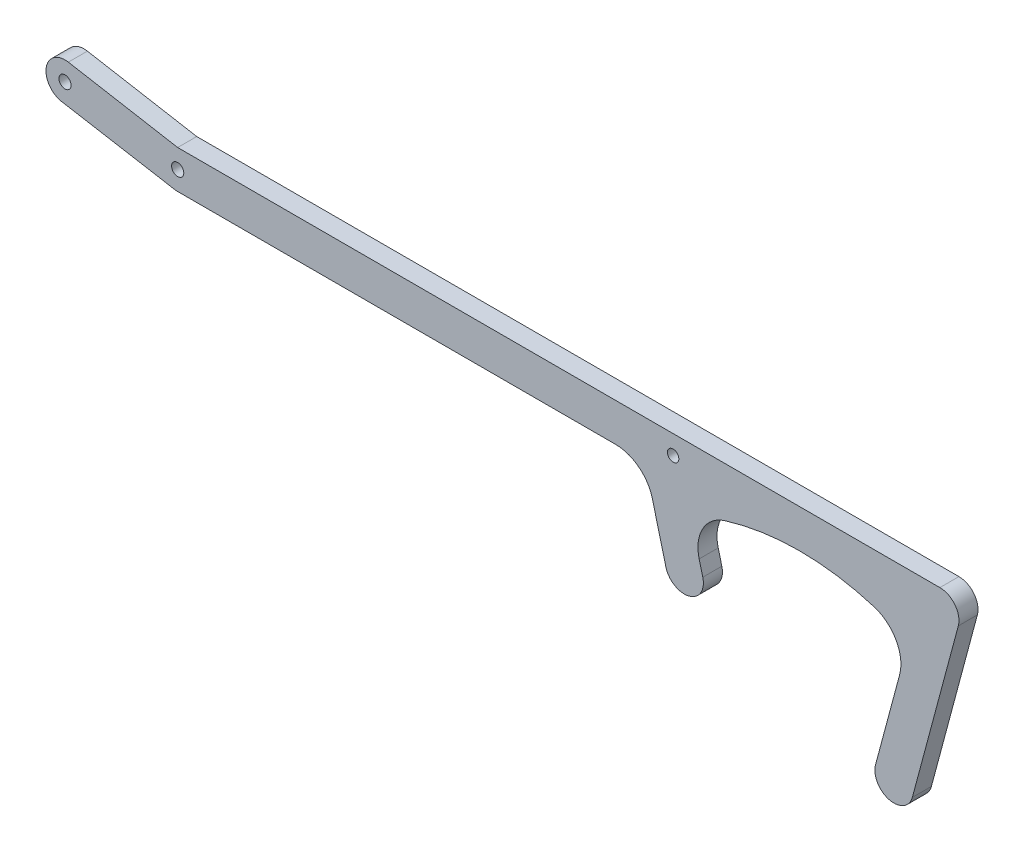
ISO-10303-21;
HEADER;
FILE_DESCRIPTION(('STEP AP214'),'2;1');
FILE_NAME('part.step','',(''),(''),'','','');
FILE_SCHEMA(('AUTOMOTIVE_DESIGN { 1 0 10303 214 1 1 1 1 }'));
ENDSEC;
DATA;
#1=APPLICATION_CONTEXT('core data for automotive mechanical design processes');
#2=APPLICATION_PROTOCOL_DEFINITION('international standard','automotive_design',2000,#1);
#3=PRODUCT_CONTEXT('',#1,'mechanical');
#4=PRODUCT('Part','Part','',(#3));
#5=PRODUCT_RELATED_PRODUCT_CATEGORY('part','',(#4));
#6=PRODUCT_DEFINITION_FORMATION('','',#4);
#7=PRODUCT_DEFINITION_CONTEXT('part definition',#1,'design');
#8=PRODUCT_DEFINITION('design','',#6,#7);
#9=PRODUCT_DEFINITION_SHAPE('','',#8);
#10=(LENGTH_UNIT() NAMED_UNIT(*) SI_UNIT(.MILLI.,.METRE.));
#11=(NAMED_UNIT(*) PLANE_ANGLE_UNIT() SI_UNIT($,.RADIAN.));
#12=(NAMED_UNIT(*) SI_UNIT($,.STERADIAN.) SOLID_ANGLE_UNIT());
#13=UNCERTAINTY_MEASURE_WITH_UNIT(LENGTH_MEASURE(1.E-05),#10,'distance_accuracy_value','');
#14=(GEOMETRIC_REPRESENTATION_CONTEXT(3) GLOBAL_UNCERTAINTY_ASSIGNED_CONTEXT((#13)) GLOBAL_UNIT_ASSIGNED_CONTEXT((#10,
#11,#12)) REPRESENTATION_CONTEXT('',''));
#15=CARTESIAN_POINT('',(0.,0.,0.));
#16=DIRECTION('',(0.,0.,1.));
#17=DIRECTION('',(1.,0.,0.));
#18=AXIS2_PLACEMENT_3D('',#15,#16,#17);
#19=CARTESIAN_POINT('',(-37.5378070842095,6.5209692001013,3.175));
#20=DIRECTION('',(0.,0.,1.));
#21=DIRECTION('',(1.,0.,0.));
#22=AXIS2_PLACEMENT_3D('',#19,#20,#21);
#23=PLANE('',#22);
#24=CARTESIAN_POINT('',(-37.5378070842095,6.5209692001013,3.175));
#25=DIRECTION('',(0.,0.,1.));
#26=DIRECTION('',(1.,0.,0.));
#27=AXIS2_PLACEMENT_3D('',#24,#25,#26);
#28=CIRCLE('',#27,2.03199999999971);
#29=CARTESIAN_POINT('',(-35.5058070842098,6.5209692001013,3.175));
#30=VERTEX_POINT('',#29);
#31=EDGE_CURVE('E507',#30,#30,#28,.T.);
#32=ORIENTED_EDGE('',*,*,#31,.F.);
#33=EDGE_LOOP('',(#32));
#34=FACE_BOUND('',#33,.T.);
#35=DIRECTION('',(-0.984807753012207,0.173648177666938,0.));
#36=VECTOR('',#35,1.);
#37=CARTESIAN_POINT('',(0.,6.35,3.175));
#38=LINE('',#37,#36);
#39=CARTESIAN_POINT('',(0.,6.35,3.175));
#40=VERTEX_POINT('',#39);
#41=CARTESIAN_POINT('',(-36.4351411560245,12.7744984317288,3.175));
#42=VERTEX_POINT('',#41);
#43=EDGE_CURVE('E211',#40,#42,#38,.T.);
#44=ORIENTED_EDGE('',*,*,#43,.T.);
#45=CARTESIAN_POINT('',(-37.5378070842095,6.5209692001013,3.175));
#46=DIRECTION('',(0.,0.,1.));
#47=DIRECTION('',(1.,0.,0.));
#48=AXIS2_PLACEMENT_3D('',#45,#46,#47);
#49=CIRCLE('',#48,6.35);
#50=CARTESIAN_POINT('',(-38.6246352842264,0.264668019399712,3.175));
#51=VERTEX_POINT('',#50);
#52=EDGE_CURVE('E199',#42,#51,#49,.T.);
#53=ORIENTED_EDGE('',*,*,#52,.T.);
#54=DIRECTION('',(0.985244280425447,-0.171154047246753,0.));
#55=VECTOR('',#54,1.);
#56=CARTESIAN_POINT('',(-38.6246352842264,0.264668019399712,3.175));
#57=LINE('',#56,#55);
#58=CARTESIAN_POINT('',(-1.08682820001688,-6.25630118070159,3.175));
#59=VERTEX_POINT('',#58);
#60=EDGE_CURVE('E210',#51,#59,#57,.T.);
#61=ORIENTED_EDGE('',*,*,#60,.T.);
#62=CARTESIAN_POINT('',(0.,0.,3.175));
#63=DIRECTION('',(0.,0.,1.));
#64=DIRECTION('',(-1.,0.,0.));
#65=AXIS2_PLACEMENT_3D('',#62,#63,#64);
#66=CIRCLE('',#65,6.35);
#67=CARTESIAN_POINT('',(0.,-6.35,3.175));
#68=VERTEX_POINT('',#67);
#69=EDGE_CURVE('E338',#59,#68,#66,.T.);
#70=ORIENTED_EDGE('',*,*,#69,.T.);
#71=DIRECTION('',(1.,0.,0.));
#72=VECTOR('',#71,1.);
#73=CARTESIAN_POINT('',(0.,-6.35,3.175));
#74=LINE('',#73,#72);
#75=CARTESIAN_POINT('',(145.882822354038,-6.35,3.175));
#76=VERTEX_POINT('',#75);
#77=EDGE_CURVE('E400',#68,#76,#74,.T.);
#78=ORIENTED_EDGE('',*,*,#77,.T.);
#79=CARTESIAN_POINT('',(145.882822354038,-19.05,3.175));
#80=DIRECTION('',(0.,0.,1.));
#81=DIRECTION('',(1.,0.,0.));
#82=AXIS2_PLACEMENT_3D('',#79,#80,#81);
#83=CIRCLE('',#82,12.7);
#84=CARTESIAN_POINT('',(158.179544478247,-15.875,3.175));
#85=VERTEX_POINT('',#84);
#86=EDGE_CURVE('E244',#76,#85,#83,.F.);
#87=ORIENTED_EDGE('',*,*,#86,.T.);
#88=DIRECTION('',(0.249999999999998,-0.968245836551855,0.));
#89=VECTOR('',#88,1.);
#90=CARTESIAN_POINT('',(162.688342590457,-33.3375,3.175));
#91=LINE('',#90,#89);
#92=CARTESIAN_POINT('',(162.688342590457,-33.3375,3.175));
#93=VERTEX_POINT('',#92);
#94=EDGE_CURVE('E406',#85,#93,#91,.T.);
#95=ORIENTED_EDGE('',*,*,#94,.T.);
#96=CARTESIAN_POINT('',(168.836703652561,-31.75,3.175));
#97=DIRECTION('',(0.,0.,1.));
#98=DIRECTION('',(1.,0.,0.));
#99=AXIS2_PLACEMENT_3D('',#96,#97,#98);
#100=CIRCLE('',#99,6.35000000000002);
#101=CARTESIAN_POINT('',(174.985064714665,-30.1625,3.175));
#102=VERTEX_POINT('',#101);
#103=EDGE_CURVE('E409',#93,#102,#100,.T.);
#104=ORIENTED_EDGE('',*,*,#103,.T.);
#105=DIRECTION('',(-0.249999999999999,0.968245836551854,0.));
#106=VECTOR('',#105,1.);
#107=CARTESIAN_POINT('',(174.985064714665,-30.1625,3.175));
#108=LINE('',#107,#106);
#109=CARTESIAN_POINT('',(173.777801974399,-25.4867915124518,3.175));
#110=VERTEX_POINT('',#109);
#111=EDGE_CURVE('E387',#102,#110,#108,.T.);
#112=ORIENTED_EDGE('',*,*,#111,.T.);
#113=CARTESIAN_POINT('',(186.074524098608,-22.3117915124518,3.175));
#114=DIRECTION('',(0.,0.,1.));
#115=DIRECTION('',(1.,0.,0.));
#116=AXIS2_PLACEMENT_3D('',#113,#114,#115);
#117=CIRCLE('',#116,12.7);
#118=CARTESIAN_POINT('',(182.328357232311,-10.176873555998,3.175));
#119=VERTEX_POINT('',#118);
#120=EDGE_CURVE('E11',#110,#119,#117,.F.);
#121=ORIENTED_EDGE('',*,*,#120,.T.);
#122=CARTESIAN_POINT('',(207.240366893182,-90.8740779664155,3.175));
#123=DIRECTION('',(0.,0.,-1.));
#124=DIRECTION('',(-1.,0.,0.));
#125=AXIS2_PLACEMENT_3D('',#122,#123,#124);
#126=CIRCLE('',#125,84.455);
#127=CARTESIAN_POINT('',(232.036420714004,-10.14116807265,3.175));
#128=VERTEX_POINT('',#127);
#129=EDGE_CURVE('E379',#119,#128,#126,.T.);
#130=ORIENTED_EDGE('',*,*,#129,.T.);
#131=CARTESIAN_POINT('',(228.307690816136,-22.28145527472,3.175));
#132=DIRECTION('',(0.,0.,1.));
#133=DIRECTION('',(1.,0.,0.));
#134=AXIS2_PLACEMENT_3D('',#131,#132,#133);
#135=CIRCLE('',#134,12.7);
#136=CARTESIAN_POINT('',(240.574948810008,-25.5684571475221,3.175));
#137=VERTEX_POINT('',#136);
#138=EDGE_CURVE('E263',#128,#137,#135,.F.);
#139=ORIENTED_EDGE('',*,*,#138,.T.);
#140=DIRECTION('',(-0.258819045102525,-0.965925826289067,0.));
#141=VECTOR('',#140,1.);
#142=CARTESIAN_POINT('',(232.553074655625,-55.506499063599,3.175));
#143=LINE('',#142,#141);
#144=CARTESIAN_POINT('',(232.553074655625,-55.506499063599,3.175));
#145=VERTEX_POINT('',#144);
#146=EDGE_CURVE('E377',#137,#145,#143,.T.);
#147=ORIENTED_EDGE('',*,*,#146,.T.);
#148=CARTESIAN_POINT('',(238.686703652561,-57.15,3.175));
#149=DIRECTION('',(0.,0.,1.));
#150=DIRECTION('',(1.,0.,0.));
#151=AXIS2_PLACEMENT_3D('',#148,#149,#150);
#152=CIRCLE('',#151,6.35000000000002);
#153=CARTESIAN_POINT('',(244.820332649497,-58.793500936401,3.175));
#154=VERTEX_POINT('',#153);
#155=EDGE_CURVE('E276',#145,#154,#152,.T.);
#156=ORIENTED_EDGE('',*,*,#155,.T.);
#157=DIRECTION('',(0.258819045102526,0.965925826289067,0.));
#158=VECTOR('',#157,1.);
#159=CARTESIAN_POINT('',(260.133628996936,-1.64350093640105,3.175));
#160=LINE('',#159,#158);
#161=CARTESIAN_POINT('',(260.133628996936,-1.64350093640105,3.175));
#162=VERTEX_POINT('',#161);
#163=EDGE_CURVE('E273',#154,#162,#160,.T.);
#164=ORIENTED_EDGE('',*,*,#163,.T.);
#165=CARTESIAN_POINT('',(254.,0.,3.175));
#166=DIRECTION('',(0.,0.,1.));
#167=DIRECTION('',(1.,0.,0.));
#168=AXIS2_PLACEMENT_3D('',#165,#166,#167);
#169=CIRCLE('',#168,6.35000000000004);
#170=CARTESIAN_POINT('',(254.,6.35,3.175));
#171=VERTEX_POINT('',#170);
#172=EDGE_CURVE('E275',#162,#171,#169,.T.);
#173=ORIENTED_EDGE('',*,*,#172,.T.);
#174=DIRECTION('',(-1.,0.,0.));
#175=VECTOR('',#174,1.);
#176=CARTESIAN_POINT('',(0.,6.35,3.175));
#177=LINE('',#176,#175);
#178=EDGE_CURVE('E216',#171,#40,#177,.T.);
#179=ORIENTED_EDGE('',*,*,#178,.T.);
#180=EDGE_LOOP('',(#44,#53,#61,#70,#78,#87,#95,#104,#112,#121,#130,#139,#147,#156,#164,#173,#179));
#181=FACE_BOUND('',#180,.T.);
#182=CARTESIAN_POINT('',(0.,0.,3.175));
#183=DIRECTION('',(0.,0.,1.));
#184=DIRECTION('',(1.,0.,0.));
#185=AXIS2_PLACEMENT_3D('',#182,#183,#184);
#186=CIRCLE('',#185,2.032);
#187=CARTESIAN_POINT('',(2.032,0.,3.175));
#188=VERTEX_POINT('',#187);
#189=EDGE_CURVE('E394',#188,#188,#186,.T.);
#190=ORIENTED_EDGE('',*,*,#189,.F.);
#191=EDGE_LOOP('',(#190));
#192=FACE_BOUND('',#191,.T.);
#193=CARTESIAN_POINT('',(165.1,0.,3.175));
#194=DIRECTION('',(0.,0.,1.));
#195=DIRECTION('',(1.,0.,0.));
#196=AXIS2_PLACEMENT_3D('',#193,#194,#195);
#197=CIRCLE('',#196,1.90499999999999);
#198=CARTESIAN_POINT('',(167.005,0.,3.175));
#199=VERTEX_POINT('',#198);
#200=EDGE_CURVE('E496',#199,#199,#197,.T.);
#201=ORIENTED_EDGE('',*,*,#200,.F.);
#202=EDGE_LOOP('',(#201));
#203=FACE_BOUND('',#202,.T.);
#204=ADVANCED_FACE('F49',(#34,#181,#192,#203),#23,.T.);
#205=CARTESIAN_POINT('',(-37.5378070842095,6.5209692001013,-3.175));
#206=DIRECTION('',(0.,0.,1.));
#207=DIRECTION('',(1.,0.,0.));
#208=AXIS2_PLACEMENT_3D('',#205,#206,#207);
#209=PLANE('',#208);
#210=DIRECTION('',(-0.984807753012207,0.173648177666938,0.));
#211=VECTOR('',#210,1.);
#212=CARTESIAN_POINT('',(0.,6.35,-3.175));
#213=LINE('',#212,#211);
#214=CARTESIAN_POINT('',(0.,6.35,-3.175));
#215=VERTEX_POINT('',#214);
#216=CARTESIAN_POINT('',(-36.4351411560245,12.7744984317288,-3.175));
#217=VERTEX_POINT('',#216);
#218=EDGE_CURVE('E225',#215,#217,#213,.T.);
#219=ORIENTED_EDGE('',*,*,#218,.F.);
#220=DIRECTION('',(-1.,0.,0.));
#221=VECTOR('',#220,1.);
#222=CARTESIAN_POINT('',(0.,6.35,-3.175));
#223=LINE('',#222,#221);
#224=CARTESIAN_POINT('',(254.,6.35,-3.175));
#225=VERTEX_POINT('',#224);
#226=EDGE_CURVE('E221',#225,#215,#223,.T.);
#227=ORIENTED_EDGE('',*,*,#226,.F.);
#228=CARTESIAN_POINT('',(254.,0.,-3.175));
#229=DIRECTION('',(0.,0.,1.));
#230=DIRECTION('',(1.,0.,0.));
#231=AXIS2_PLACEMENT_3D('',#228,#229,#230);
#232=CIRCLE('',#231,6.35000000000004);
#233=CARTESIAN_POINT('',(260.133628996936,-1.64350093640105,-3.175));
#234=VERTEX_POINT('',#233);
#235=EDGE_CURVE('E284',#234,#225,#232,.T.);
#236=ORIENTED_EDGE('',*,*,#235,.F.);
#237=DIRECTION('',(0.258819045102526,0.965925826289067,0.));
#238=VECTOR('',#237,1.);
#239=CARTESIAN_POINT('',(260.133628996936,-1.64350093640105,-3.175));
#240=LINE('',#239,#238);
#241=CARTESIAN_POINT('',(244.820332649497,-58.793500936401,-3.175));
#242=VERTEX_POINT('',#241);
#243=EDGE_CURVE('E282',#242,#234,#240,.T.);
#244=ORIENTED_EDGE('',*,*,#243,.F.);
#245=CARTESIAN_POINT('',(238.686703652561,-57.15,-3.175));
#246=DIRECTION('',(0.,0.,1.));
#247=DIRECTION('',(1.,0.,0.));
#248=AXIS2_PLACEMENT_3D('',#245,#246,#247);
#249=CIRCLE('',#248,6.35000000000002);
#250=CARTESIAN_POINT('',(232.553074655625,-55.506499063599,-3.175));
#251=VERTEX_POINT('',#250);
#252=EDGE_CURVE('E280',#251,#242,#249,.T.);
#253=ORIENTED_EDGE('',*,*,#252,.F.);
#254=DIRECTION('',(-0.258819045102525,-0.965925826289067,0.));
#255=VECTOR('',#254,1.);
#256=CARTESIAN_POINT('',(232.553074655625,-55.506499063599,-3.175));
#257=LINE('',#256,#255);
#258=CARTESIAN_POINT('',(240.574948810008,-25.5684571475221,-3.175));
#259=VERTEX_POINT('',#258);
#260=EDGE_CURVE('E278',#259,#251,#257,.T.);
#261=ORIENTED_EDGE('',*,*,#260,.F.);
#262=CARTESIAN_POINT('',(228.307690816136,-22.28145527472,-3.175));
#263=DIRECTION('',(0.,0.,1.));
#264=DIRECTION('',(1.,0.,0.));
#265=AXIS2_PLACEMENT_3D('',#262,#263,#264);
#266=CIRCLE('',#265,12.7);
#267=CARTESIAN_POINT('',(232.036420714004,-10.14116807265,-3.175));
#268=VERTEX_POINT('',#267);
#269=EDGE_CURVE('E260',#259,#268,#266,.T.);
#270=ORIENTED_EDGE('',*,*,#269,.T.);
#271=CARTESIAN_POINT('',(207.240366893182,-90.8740779664155,-3.175));
#272=DIRECTION('',(0.,0.,-1.));
#273=DIRECTION('',(-1.,0.,0.));
#274=AXIS2_PLACEMENT_3D('',#271,#272,#273);
#275=CIRCLE('',#274,84.455);
#276=CARTESIAN_POINT('',(182.328357232311,-10.176873555998,-3.175));
#277=VERTEX_POINT('',#276);
#278=EDGE_CURVE('E270',#277,#268,#275,.T.);
#279=ORIENTED_EDGE('',*,*,#278,.F.);
#280=CARTESIAN_POINT('',(186.074524098608,-22.3117915124518,-3.175));
#281=DIRECTION('',(0.,0.,1.));
#282=DIRECTION('',(1.,0.,0.));
#283=AXIS2_PLACEMENT_3D('',#280,#281,#282);
#284=CIRCLE('',#283,12.7);
#285=CARTESIAN_POINT('',(173.777801974399,-25.4867915124518,-3.175));
#286=VERTEX_POINT('',#285);
#287=EDGE_CURVE('E58',#277,#286,#284,.T.);
#288=ORIENTED_EDGE('',*,*,#287,.T.);
#289=DIRECTION('',(-0.249999999999999,0.968245836551854,0.));
#290=VECTOR('',#289,1.);
#291=CARTESIAN_POINT('',(174.985064714665,-30.1625,-3.175));
#292=LINE('',#291,#290);
#293=CARTESIAN_POINT('',(174.985064714665,-30.1625,-3.175));
#294=VERTEX_POINT('',#293);
#295=EDGE_CURVE('E268',#294,#286,#292,.T.);
#296=ORIENTED_EDGE('',*,*,#295,.F.);
#297=CARTESIAN_POINT('',(168.836703652561,-31.75,-3.175));
#298=DIRECTION('',(0.,0.,1.));
#299=DIRECTION('',(1.,0.,0.));
#300=AXIS2_PLACEMENT_3D('',#297,#298,#299);
#301=CIRCLE('',#300,6.35000000000002);
#302=CARTESIAN_POINT('',(162.688342590457,-33.3375,-3.175));
#303=VERTEX_POINT('',#302);
#304=EDGE_CURVE('E271',#303,#294,#301,.T.);
#305=ORIENTED_EDGE('',*,*,#304,.F.);
#306=DIRECTION('',(0.249999999999998,-0.968245836551855,0.));
#307=VECTOR('',#306,1.);
#308=CARTESIAN_POINT('',(162.688342590457,-33.3375,-3.175));
#309=LINE('',#308,#307);
#310=CARTESIAN_POINT('',(158.179544478247,-15.875,-3.175));
#311=VERTEX_POINT('',#310);
#312=EDGE_CURVE('E352',#311,#303,#309,.T.);
#313=ORIENTED_EDGE('',*,*,#312,.F.);
#314=CARTESIAN_POINT('',(145.882822354038,-19.05,-3.175));
#315=DIRECTION('',(0.,0.,1.));
#316=DIRECTION('',(1.,0.,0.));
#317=AXIS2_PLACEMENT_3D('',#314,#315,#316);
#318=CIRCLE('',#317,12.7);
#319=CARTESIAN_POINT('',(145.882822354038,-6.35,-3.175));
#320=VERTEX_POINT('',#319);
#321=EDGE_CURVE('E241',#311,#320,#318,.T.);
#322=ORIENTED_EDGE('',*,*,#321,.T.);
#323=DIRECTION('',(1.,0.,0.));
#324=VECTOR('',#323,1.);
#325=CARTESIAN_POINT('',(0.,-6.35,-3.175));
#326=LINE('',#325,#324);
#327=CARTESIAN_POINT('',(0.,-6.35,-3.175));
#328=VERTEX_POINT('',#327);
#329=EDGE_CURVE('E346',#328,#320,#326,.T.);
#330=ORIENTED_EDGE('',*,*,#329,.F.);
#331=CARTESIAN_POINT('',(0.,0.,-3.175));
#332=DIRECTION('',(0.,0.,1.));
#333=DIRECTION('',(-1.,0.,0.));
#334=AXIS2_PLACEMENT_3D('',#331,#332,#333);
#335=CIRCLE('',#334,6.35);
#336=CARTESIAN_POINT('',(-1.08682820001688,-6.25630118070159,-3.175));
#337=VERTEX_POINT('',#336);
#338=EDGE_CURVE('E337',#337,#328,#335,.T.);
#339=ORIENTED_EDGE('',*,*,#338,.F.);
#340=DIRECTION('',(0.985244280425447,-0.171154047246753,0.));
#341=VECTOR('',#340,1.);
#342=CARTESIAN_POINT('',(-38.6246352842264,0.264668019399712,-3.175));
#343=LINE('',#342,#341);
#344=CARTESIAN_POINT('',(-38.6246352842264,0.264668019399712,-3.175));
#345=VERTEX_POINT('',#344);
#346=EDGE_CURVE('E344',#345,#337,#343,.T.);
#347=ORIENTED_EDGE('',*,*,#346,.F.);
#348=CARTESIAN_POINT('',(-37.5378070842095,6.5209692001013,-3.175));
#349=DIRECTION('',(0.,0.,1.));
#350=DIRECTION('',(1.,0.,0.));
#351=AXIS2_PLACEMENT_3D('',#348,#349,#350);
#352=CIRCLE('',#351,6.35);
#353=EDGE_CURVE('E354',#217,#345,#352,.T.);
#354=ORIENTED_EDGE('',*,*,#353,.F.);
#355=EDGE_LOOP('',(#219,#227,#236,#244,#253,#261,#270,#279,#288,#296,#305,#313,#322,#330,#339,
#347,#354));
#356=FACE_BOUND('',#355,.T.);
#357=CARTESIAN_POINT('',(0.,0.,-3.175));
#358=DIRECTION('',(0.,0.,1.));
#359=DIRECTION('',(1.,0.,0.));
#360=AXIS2_PLACEMENT_3D('',#357,#358,#359);
#361=CIRCLE('',#360,2.032);
#362=CARTESIAN_POINT('',(2.032,0.,-3.175));
#363=VERTEX_POINT('',#362);
#364=EDGE_CURVE('E510',#363,#363,#361,.T.);
#365=ORIENTED_EDGE('',*,*,#364,.T.);
#366=EDGE_LOOP('',(#365));
#367=FACE_BOUND('',#366,.T.);
#368=CARTESIAN_POINT('',(-37.5378070842095,6.5209692001013,-3.175));
#369=DIRECTION('',(0.,0.,1.));
#370=DIRECTION('',(1.,0.,0.));
#371=AXIS2_PLACEMENT_3D('',#368,#369,#370);
#372=CIRCLE('',#371,2.03199999999971);
#373=CARTESIAN_POINT('',(-35.5058070842098,6.5209692001013,-3.175));
#374=VERTEX_POINT('',#373);
#375=EDGE_CURVE('E504',#374,#374,#372,.T.);
#376=ORIENTED_EDGE('',*,*,#375,.T.);
#377=EDGE_LOOP('',(#376));
#378=FACE_BOUND('',#377,.T.);
#379=CARTESIAN_POINT('',(165.1,0.,-3.175));
#380=DIRECTION('',(0.,0.,1.));
#381=DIRECTION('',(1.,0.,0.));
#382=AXIS2_PLACEMENT_3D('',#379,#380,#381);
#383=CIRCLE('',#382,1.90499999999999);
#384=CARTESIAN_POINT('',(167.005,0.,-3.175));
#385=VERTEX_POINT('',#384);
#386=EDGE_CURVE('E499',#385,#385,#383,.T.);
#387=ORIENTED_EDGE('',*,*,#386,.T.);
#388=EDGE_LOOP('',(#387));
#389=FACE_BOUND('',#388,.T.);
#390=ADVANCED_FACE('F342',(#356,#367,#378,#389),#209,.F.);
#391=CARTESIAN_POINT('',(0.,6.35,3.175));
#392=DIRECTION('',(-0.173648177666938,-0.984807753012207,0.));
#393=DIRECTION('',(0.984807753012207,-0.173648177666938,0.));
#394=AXIS2_PLACEMENT_3D('',#391,#392,#393);
#395=PLANE('',#394);
#396=ORIENTED_EDGE('',*,*,#218,.T.);
#397=DIRECTION('',(0.,0.,-1.));
#398=VECTOR('',#397,1.);
#399=CARTESIAN_POINT('',(-36.4351411560245,12.7744984317288,3.175));
#400=LINE('',#399,#398);
#401=EDGE_CURVE('E203',#42,#217,#400,.T.);
#402=ORIENTED_EDGE('',*,*,#401,.F.);
#403=ORIENTED_EDGE('',*,*,#43,.F.);
#404=DIRECTION('',(0.,0.,-1.));
#405=VECTOR('',#404,1.);
#406=CARTESIAN_POINT('',(0.,6.35,3.175));
#407=LINE('',#406,#405);
#408=EDGE_CURVE('E305',#40,#215,#407,.T.);
#409=ORIENTED_EDGE('',*,*,#408,.T.);
#410=EDGE_LOOP('',(#396,#402,#403,#409));
#411=FACE_BOUND('',#410,.T.);
#412=ADVANCED_FACE('F223',(#411),#395,.F.);
#413=CARTESIAN_POINT('',(-37.5378070842095,6.5209692001013,3.175));
#414=DIRECTION('',(0.,0.,-1.));
#415=DIRECTION('',(-1.,0.,0.));
#416=AXIS2_PLACEMENT_3D('',#413,#414,#415);
#417=CYLINDRICAL_SURFACE('',#416,6.35);
#418=ORIENTED_EDGE('',*,*,#353,.T.);
#419=DIRECTION('',(0.,0.,-1.));
#420=VECTOR('',#419,1.);
#421=CARTESIAN_POINT('',(-38.6246352842264,0.264668019399712,3.175));
#422=LINE('',#421,#420);
#423=EDGE_CURVE('E206',#51,#345,#422,.T.);
#424=ORIENTED_EDGE('',*,*,#423,.F.);
#425=ORIENTED_EDGE('',*,*,#52,.F.);
#426=ORIENTED_EDGE('',*,*,#401,.T.);
#427=EDGE_LOOP('',(#418,#424,#425,#426));
#428=FACE_BOUND('',#427,.T.);
#429=ADVANCED_FACE('F201',(#428),#417,.T.);
#430=CARTESIAN_POINT('',(-38.6246352842264,0.264668019399712,3.175));
#431=DIRECTION('',(0.171154047246753,0.985244280425447,0.));
#432=DIRECTION('',(-0.985244280425447,0.171154047246753,0.));
#433=AXIS2_PLACEMENT_3D('',#430,#431,#432);
#434=PLANE('',#433);
#435=ORIENTED_EDGE('',*,*,#346,.T.);
#436=DIRECTION('',(0.,0.,-1.));
#437=VECTOR('',#436,1.);
#438=CARTESIAN_POINT('',(-1.08682820001688,-6.25630118070159,3.175));
#439=LINE('',#438,#437);
#440=EDGE_CURVE('E235',#59,#337,#439,.T.);
#441=ORIENTED_EDGE('',*,*,#440,.F.);
#442=ORIENTED_EDGE('',*,*,#60,.F.);
#443=ORIENTED_EDGE('',*,*,#423,.T.);
#444=EDGE_LOOP('',(#435,#441,#442,#443));
#445=FACE_BOUND('',#444,.T.);
#446=ADVANCED_FACE('F397',(#445),#434,.F.);
#447=CARTESIAN_POINT('',(0.,0.,3.175));
#448=DIRECTION('',(0.,0.,-1.));
#449=DIRECTION('',(-1.,0.,0.));
#450=AXIS2_PLACEMENT_3D('',#447,#448,#449);
#451=CYLINDRICAL_SURFACE('',#450,6.35);
#452=ORIENTED_EDGE('',*,*,#338,.T.);
#453=DIRECTION('',(0.,0.,-1.));
#454=VECTOR('',#453,1.);
#455=CARTESIAN_POINT('',(0.,-6.35,3.175));
#456=LINE('',#455,#454);
#457=EDGE_CURVE('E324',#68,#328,#456,.T.);
#458=ORIENTED_EDGE('',*,*,#457,.F.);
#459=ORIENTED_EDGE('',*,*,#69,.F.);
#460=ORIENTED_EDGE('',*,*,#440,.T.);
#461=EDGE_LOOP('',(#452,#458,#459,#460));
#462=FACE_BOUND('',#461,.T.);
#463=ADVANCED_FACE('F335',(#462),#451,.T.);
#464=CARTESIAN_POINT('',(0.,-6.35,3.175));
#465=DIRECTION('',(0.,1.,0.));
#466=DIRECTION('',(-1.,0.,0.));
#467=AXIS2_PLACEMENT_3D('',#464,#465,#466);
#468=PLANE('',#467);
#469=ORIENTED_EDGE('',*,*,#329,.T.);
#470=DIRECTION('',(0.,0.,-1.));
#471=VECTOR('',#470,1.);
#472=CARTESIAN_POINT('',(145.882822354038,-6.35,3.175));
#473=LINE('',#472,#471);
#474=EDGE_CURVE('E232',#320,#76,#473,.F.);
#475=ORIENTED_EDGE('',*,*,#474,.T.);
#476=ORIENTED_EDGE('',*,*,#77,.F.);
#477=ORIENTED_EDGE('',*,*,#457,.T.);
#478=EDGE_LOOP('',(#469,#475,#476,#477));
#479=FACE_BOUND('',#478,.T.);
#480=ADVANCED_FACE('F460',(#479),#468,.F.);
#481=CARTESIAN_POINT('',(162.688342590457,-33.3375,3.175));
#482=DIRECTION('',(0.968245836551855,0.249999999999998,0.));
#483=DIRECTION('',(-0.249999999999998,0.968245836551855,0.));
#484=AXIS2_PLACEMENT_3D('',#481,#482,#483);
#485=PLANE('',#484);
#486=ORIENTED_EDGE('',*,*,#94,.F.);
#487=DIRECTION('',(0.,0.,-1.));
#488=VECTOR('',#487,1.);
#489=CARTESIAN_POINT('',(158.179544478247,-15.875,-3.175));
#490=LINE('',#489,#488);
#491=EDGE_CURVE('E227',#85,#311,#490,.T.);
#492=ORIENTED_EDGE('',*,*,#491,.T.);
#493=ORIENTED_EDGE('',*,*,#312,.T.);
#494=DIRECTION('',(0.,0.,-1.));
#495=VECTOR('',#494,1.);
#496=CARTESIAN_POINT('',(162.688342590457,-33.3375,3.175));
#497=LINE('',#496,#495);
#498=EDGE_CURVE('E296',#93,#303,#497,.T.);
#499=ORIENTED_EDGE('',*,*,#498,.F.);
#500=EDGE_LOOP('',(#486,#492,#493,#499));
#501=FACE_BOUND('',#500,.T.);
#502=ADVANCED_FACE('F456',(#501),#485,.F.);
#503=CARTESIAN_POINT('',(168.836703652561,-31.75,3.175));
#504=DIRECTION('',(0.,0.,-1.));
#505=DIRECTION('',(-1.,0.,0.));
#506=AXIS2_PLACEMENT_3D('',#503,#504,#505);
#507=CYLINDRICAL_SURFACE('',#506,6.35000000000002);
#508=ORIENTED_EDGE('',*,*,#304,.T.);
#509=DIRECTION('',(0.,0.,-1.));
#510=VECTOR('',#509,1.);
#511=CARTESIAN_POINT('',(174.985064714665,-30.1625,3.175));
#512=LINE('',#511,#510);
#513=EDGE_CURVE('E294',#102,#294,#512,.T.);
#514=ORIENTED_EDGE('',*,*,#513,.F.);
#515=ORIENTED_EDGE('',*,*,#103,.F.);
#516=ORIENTED_EDGE('',*,*,#498,.T.);
#517=EDGE_LOOP('',(#508,#514,#515,#516));
#518=FACE_BOUND('',#517,.T.);
#519=ADVANCED_FACE('F453',(#518),#507,.T.);
#520=CARTESIAN_POINT('',(174.985064714665,-30.1625,3.175));
#521=DIRECTION('',(-0.968245836551854,-0.249999999999999,0.));
#522=DIRECTION('',(0.25,-0.968245836551854,0.));
#523=AXIS2_PLACEMENT_3D('',#520,#521,#522);
#524=PLANE('',#523);
#525=ORIENTED_EDGE('',*,*,#295,.T.);
#526=DIRECTION('',(0.,0.,1.));
#527=VECTOR('',#526,1.);
#528=CARTESIAN_POINT('',(173.777801974399,-25.4867915124518,3.175));
#529=LINE('',#528,#527);
#530=EDGE_CURVE('E68',#286,#110,#529,.T.);
#531=ORIENTED_EDGE('',*,*,#530,.T.);
#532=ORIENTED_EDGE('',*,*,#111,.F.);
#533=ORIENTED_EDGE('',*,*,#513,.T.);
#534=EDGE_LOOP('',(#525,#531,#532,#533));
#535=FACE_BOUND('',#534,.T.);
#536=ADVANCED_FACE('F450',(#535),#524,.F.);
#537=CARTESIAN_POINT('',(207.240366893182,-90.8740779664155,3.175));
#538=DIRECTION('',(0.,0.,-1.));
#539=DIRECTION('',(-1.,0.,0.));
#540=AXIS2_PLACEMENT_3D('',#537,#538,#539);
#541=CYLINDRICAL_SURFACE('',#540,84.455);
#542=ORIENTED_EDGE('',*,*,#278,.T.);
#543=DIRECTION('',(0.,0.,-1.));
#544=VECTOR('',#543,1.);
#545=CARTESIAN_POINT('',(232.036420714004,-10.14116807265,3.175));
#546=LINE('',#545,#544);
#547=EDGE_CURVE('E255',#268,#128,#546,.F.);
#548=ORIENTED_EDGE('',*,*,#547,.T.);
#549=ORIENTED_EDGE('',*,*,#129,.F.);
#550=DIRECTION('',(0.,0.,-1.));
#551=VECTOR('',#550,1.);
#552=CARTESIAN_POINT('',(182.328357232311,-10.176873555998,3.175));
#553=LINE('',#552,#551);
#554=EDGE_CURVE('E251',#119,#277,#553,.T.);
#555=ORIENTED_EDGE('',*,*,#554,.T.);
#556=EDGE_LOOP('',(#542,#548,#549,#555));
#557=FACE_BOUND('',#556,.T.);
#558=ADVANCED_FACE('F368',(#557),#541,.F.);
#559=CARTESIAN_POINT('',(232.553074655625,-55.506499063599,3.175));
#560=DIRECTION('',(0.965925826289067,-0.258819045102525,0.));
#561=DIRECTION('',(0.258819045102525,0.965925826289067,0.));
#562=AXIS2_PLACEMENT_3D('',#559,#560,#561);
#563=PLANE('',#562);
#564=ORIENTED_EDGE('',*,*,#146,.F.);
#565=DIRECTION('',(0.,0.,1.));
#566=VECTOR('',#565,1.);
#567=CARTESIAN_POINT('',(240.574948810008,-25.5684571475221,-3.175));
#568=LINE('',#567,#566);
#569=EDGE_CURVE('E247',#137,#259,#568,.F.);
#570=ORIENTED_EDGE('',*,*,#569,.T.);
#571=ORIENTED_EDGE('',*,*,#260,.T.);
#572=DIRECTION('',(0.,0.,-1.));
#573=VECTOR('',#572,1.);
#574=CARTESIAN_POINT('',(232.553074655625,-55.506499063599,3.175));
#575=LINE('',#574,#573);
#576=EDGE_CURVE('E291',#145,#251,#575,.T.);
#577=ORIENTED_EDGE('',*,*,#576,.F.);
#578=EDGE_LOOP('',(#564,#570,#571,#577));
#579=FACE_BOUND('',#578,.T.);
#580=ADVANCED_FACE('F381',(#579),#563,.F.);
#581=CARTESIAN_POINT('',(238.686703652561,-57.15,3.175));
#582=DIRECTION('',(0.,0.,-1.));
#583=DIRECTION('',(-1.,0.,0.));
#584=AXIS2_PLACEMENT_3D('',#581,#582,#583);
#585=CYLINDRICAL_SURFACE('',#584,6.35000000000002);
#586=ORIENTED_EDGE('',*,*,#252,.T.);
#587=DIRECTION('',(0.,0.,-1.));
#588=VECTOR('',#587,1.);
#589=CARTESIAN_POINT('',(244.820332649497,-58.793500936401,3.175));
#590=LINE('',#589,#588);
#591=EDGE_CURVE('E288',#154,#242,#590,.T.);
#592=ORIENTED_EDGE('',*,*,#591,.F.);
#593=ORIENTED_EDGE('',*,*,#155,.F.);
#594=ORIENTED_EDGE('',*,*,#576,.T.);
#595=EDGE_LOOP('',(#586,#592,#593,#594));
#596=FACE_BOUND('',#595,.T.);
#597=ADVANCED_FACE('F441',(#596),#585,.T.);
#598=CARTESIAN_POINT('',(260.133628996936,-1.64350093640105,3.175));
#599=DIRECTION('',(-0.965925826289067,0.258819045102526,0.));
#600=DIRECTION('',(-0.258819045102526,-0.965925826289067,0.));
#601=AXIS2_PLACEMENT_3D('',#598,#599,#600);
#602=PLANE('',#601);
#603=ORIENTED_EDGE('',*,*,#243,.T.);
#604=DIRECTION('',(0.,0.,-1.));
#605=VECTOR('',#604,1.);
#606=CARTESIAN_POINT('',(260.133628996936,-1.64350093640105,3.175));
#607=LINE('',#606,#605);
#608=EDGE_CURVE('E292',#162,#234,#607,.T.);
#609=ORIENTED_EDGE('',*,*,#608,.F.);
#610=ORIENTED_EDGE('',*,*,#163,.F.);
#611=ORIENTED_EDGE('',*,*,#591,.T.);
#612=EDGE_LOOP('',(#603,#609,#610,#611));
#613=FACE_BOUND('',#612,.T.);
#614=ADVANCED_FACE('F438',(#613),#602,.F.);
#615=CARTESIAN_POINT('',(254.,0.,3.175));
#616=DIRECTION('',(0.,0.,-1.));
#617=DIRECTION('',(-1.,0.,0.));
#618=AXIS2_PLACEMENT_3D('',#615,#616,#617);
#619=CYLINDRICAL_SURFACE('',#618,6.35000000000004);
#620=ORIENTED_EDGE('',*,*,#235,.T.);
#621=DIRECTION('',(0.,0.,-1.));
#622=VECTOR('',#621,1.);
#623=CARTESIAN_POINT('',(254.,6.35,3.175));
#624=LINE('',#623,#622);
#625=EDGE_CURVE('E301',#171,#225,#624,.T.);
#626=ORIENTED_EDGE('',*,*,#625,.F.);
#627=ORIENTED_EDGE('',*,*,#172,.F.);
#628=ORIENTED_EDGE('',*,*,#608,.T.);
#629=EDGE_LOOP('',(#620,#626,#627,#628));
#630=FACE_BOUND('',#629,.T.);
#631=ADVANCED_FACE('F434',(#630),#619,.T.);
#632=CARTESIAN_POINT('',(0.,6.35,3.175));
#633=DIRECTION('',(0.,-1.,0.));
#634=DIRECTION('',(0.,0.,-1.));
#635=AXIS2_PLACEMENT_3D('',#632,#633,#634);
#636=PLANE('',#635);
#637=ORIENTED_EDGE('',*,*,#226,.T.);
#638=ORIENTED_EDGE('',*,*,#408,.F.);
#639=ORIENTED_EDGE('',*,*,#178,.F.);
#640=ORIENTED_EDGE('',*,*,#625,.T.);
#641=EDGE_LOOP('',(#637,#638,#639,#640));
#642=FACE_BOUND('',#641,.T.);
#643=ADVANCED_FACE('F431',(#642),#636,.F.);
#644=CARTESIAN_POINT('',(0.,0.,3.175));
#645=DIRECTION('',(0.,0.,-1.));
#646=DIRECTION('',(-1.,0.,0.));
#647=AXIS2_PLACEMENT_3D('',#644,#645,#646);
#648=CYLINDRICAL_SURFACE('',#647,2.032);
#649=ORIENTED_EDGE('',*,*,#189,.T.);
#650=EDGE_LOOP('',(#649));
#651=FACE_BOUND('',#650,.T.);
#652=ORIENTED_EDGE('',*,*,#364,.F.);
#653=EDGE_LOOP('',(#652));
#654=FACE_BOUND('',#653,.T.);
#655=ADVANCED_FACE('F428',(#651,#654),#648,.F.);
#656=CARTESIAN_POINT('',(-37.5378070842095,6.5209692001013,3.175));
#657=DIRECTION('',(0.,0.,-1.));
#658=DIRECTION('',(-1.,0.,0.));
#659=AXIS2_PLACEMENT_3D('',#656,#657,#658);
#660=CYLINDRICAL_SURFACE('',#659,2.03199999999971);
#661=ORIENTED_EDGE('',*,*,#31,.T.);
#662=EDGE_LOOP('',(#661));
#663=FACE_BOUND('',#662,.T.);
#664=ORIENTED_EDGE('',*,*,#375,.F.);
#665=EDGE_LOOP('',(#664));
#666=FACE_BOUND('',#665,.T.);
#667=ADVANCED_FACE('F477',(#663,#666),#660,.F.);
#668=CARTESIAN_POINT('',(165.1,0.,3.175));
#669=DIRECTION('',(0.,0.,-1.));
#670=DIRECTION('',(-1.,0.,0.));
#671=AXIS2_PLACEMENT_3D('',#668,#669,#670);
#672=CYLINDRICAL_SURFACE('',#671,1.90499999999999);
#673=ORIENTED_EDGE('',*,*,#200,.T.);
#674=EDGE_LOOP('',(#673));
#675=FACE_BOUND('',#674,.T.);
#676=ORIENTED_EDGE('',*,*,#386,.F.);
#677=EDGE_LOOP('',(#676));
#678=FACE_BOUND('',#677,.T.);
#679=ADVANCED_FACE('F473',(#675,#678),#672,.F.);
#680=CARTESIAN_POINT('',(145.882822354038,-19.05,3.175));
#681=DIRECTION('',(0.,0.,1.));
#682=DIRECTION('',(1.,0.,0.));
#683=AXIS2_PLACEMENT_3D('',#680,#681,#682);
#684=CYLINDRICAL_SURFACE('',#683,12.7);
#685=ORIENTED_EDGE('',*,*,#86,.F.);
#686=ORIENTED_EDGE('',*,*,#474,.F.);
#687=ORIENTED_EDGE('',*,*,#321,.F.);
#688=ORIENTED_EDGE('',*,*,#491,.F.);
#689=EDGE_LOOP('',(#685,#686,#687,#688));
#690=FACE_BOUND('',#689,.T.);
#691=ADVANCED_FACE('F418',(#690),#684,.F.);
#692=CARTESIAN_POINT('',(228.307690816136,-22.28145527472,3.175));
#693=DIRECTION('',(0.,0.,-1.));
#694=DIRECTION('',(-1.,0.,0.));
#695=AXIS2_PLACEMENT_3D('',#692,#693,#694);
#696=CYLINDRICAL_SURFACE('',#695,12.7);
#697=ORIENTED_EDGE('',*,*,#138,.F.);
#698=ORIENTED_EDGE('',*,*,#547,.F.);
#699=ORIENTED_EDGE('',*,*,#269,.F.);
#700=ORIENTED_EDGE('',*,*,#569,.F.);
#701=EDGE_LOOP('',(#697,#698,#699,#700));
#702=FACE_BOUND('',#701,.T.);
#703=ADVANCED_FACE('F374',(#702),#696,.F.);
#704=CARTESIAN_POINT('',(186.074524098608,-22.3117915124518,3.175));
#705=DIRECTION('',(0.,0.,-1.));
#706=DIRECTION('',(-1.,0.,0.));
#707=AXIS2_PLACEMENT_3D('',#704,#705,#706);
#708=CYLINDRICAL_SURFACE('',#707,12.7);
#709=ORIENTED_EDGE('',*,*,#120,.F.);
#710=ORIENTED_EDGE('',*,*,#530,.F.);
#711=ORIENTED_EDGE('',*,*,#287,.F.);
#712=ORIENTED_EDGE('',*,*,#554,.F.);
#713=EDGE_LOOP('',(#709,#710,#711,#712));
#714=FACE_BOUND('',#713,.T.);
#715=ADVANCED_FACE('F51',(#714),#708,.F.);
#716=CLOSED_SHELL('',(#204,#390,#412,#429,#446,#463,#480,#502,#519,#536,#558,#580,#597,#614,
#631,#643,#655,#667,#679,#691,#703,#715));
#717=MANIFOLD_SOLID_BREP('B2',#716);
#718=ADVANCED_BREP_SHAPE_REPRESENTATION('',(#18,#717),#14);
#719=SHAPE_DEFINITION_REPRESENTATION(#9,#718);
ENDSEC;
END-ISO-10303-21;
